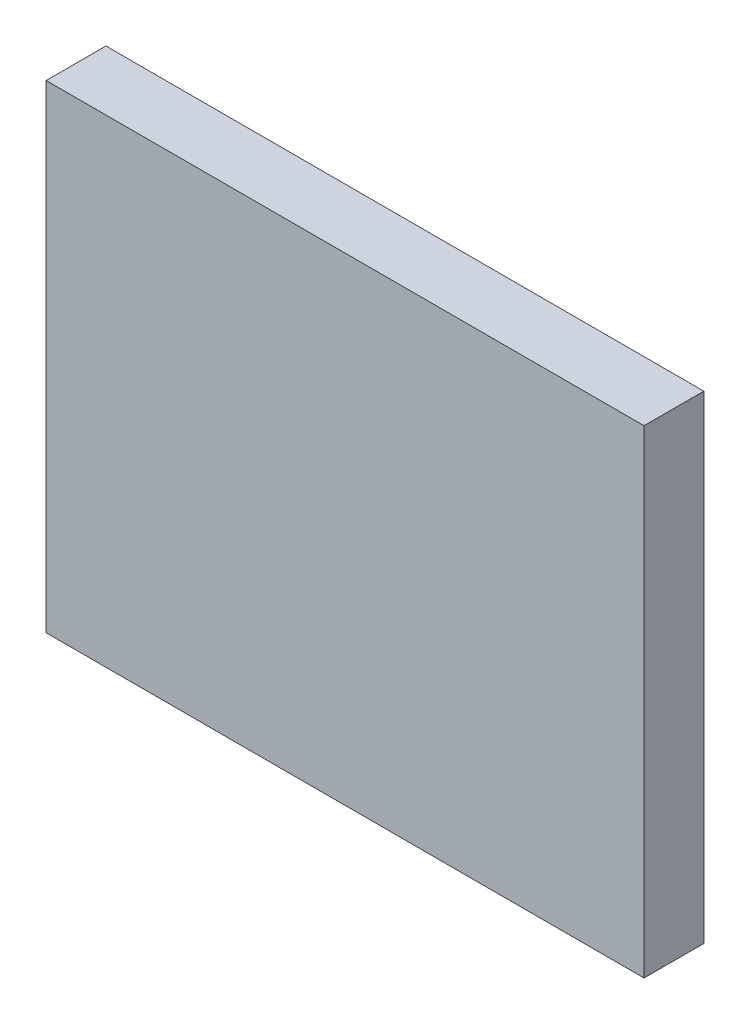
ISO-10303-21;
HEADER;
FILE_DESCRIPTION(('STEP AP214'),'2;1');
FILE_NAME('part.step','',(''),(''),'','','');
FILE_SCHEMA(('AUTOMOTIVE_DESIGN { 1 0 10303 214 1 1 1 1 }'));
ENDSEC;
DATA;
#1=APPLICATION_CONTEXT('core data for automotive mechanical design processes');
#2=APPLICATION_PROTOCOL_DEFINITION('international standard','automotive_design',2000,#1);
#3=PRODUCT_CONTEXT('',#1,'mechanical');
#4=PRODUCT('Part','Part','',(#3));
#5=PRODUCT_RELATED_PRODUCT_CATEGORY('part','',(#4));
#6=PRODUCT_DEFINITION_FORMATION('','',#4);
#7=PRODUCT_DEFINITION_CONTEXT('part definition',#1,'design');
#8=PRODUCT_DEFINITION('design','',#6,#7);
#9=PRODUCT_DEFINITION_SHAPE('','',#8);
#10=(LENGTH_UNIT() NAMED_UNIT(*) SI_UNIT(.MILLI.,.METRE.));
#11=(NAMED_UNIT(*) PLANE_ANGLE_UNIT() SI_UNIT($,.RADIAN.));
#12=(NAMED_UNIT(*) SI_UNIT($,.STERADIAN.) SOLID_ANGLE_UNIT());
#13=UNCERTAINTY_MEASURE_WITH_UNIT(LENGTH_MEASURE(1.E-05),#10,'distance_accuracy_value','');
#14=(GEOMETRIC_REPRESENTATION_CONTEXT(3) GLOBAL_UNCERTAINTY_ASSIGNED_CONTEXT((#13)) GLOBAL_UNIT_ASSIGNED_CONTEXT((#10,
#11,#12)) REPRESENTATION_CONTEXT('',''));
#15=CARTESIAN_POINT('',(0.,0.,0.));
#16=DIRECTION('',(0.,0.,1.));
#17=DIRECTION('',(1.,0.,0.));
#18=AXIS2_PLACEMENT_3D('',#15,#16,#17);
#19=CARTESIAN_POINT('',(0.,40.,5.));
#20=DIRECTION('',(1.,0.,0.));
#21=DIRECTION('',(0.,1.,0.));
#22=AXIS2_PLACEMENT_3D('',#19,#20,#21);
#23=PLANE('',#22);
#24=DIRECTION('',(0.,-1.,0.));
#25=VECTOR('',#24,1.);
#26=CARTESIAN_POINT('',(0.,40.,0.));
#27=LINE('',#26,#25);
#28=CARTESIAN_POINT('',(0.,40.,0.));
#29=VERTEX_POINT('',#28);
#30=CARTESIAN_POINT('',(0.,0.,0.));
#31=VERTEX_POINT('',#30);
#32=EDGE_CURVE('E96',#29,#31,#27,.T.);
#33=ORIENTED_EDGE('',*,*,#32,.T.);
#34=DIRECTION('',(0.,0.,-1.));
#35=VECTOR('',#34,1.);
#36=CARTESIAN_POINT('',(0.,0.,5.));
#37=LINE('',#36,#35);
#38=CARTESIAN_POINT('',(0.,0.,5.));
#39=VERTEX_POINT('',#38);
#40=EDGE_CURVE('E11',#39,#31,#37,.T.);
#41=ORIENTED_EDGE('',*,*,#40,.F.);
#42=DIRECTION('',(0.,-1.,0.));
#43=VECTOR('',#42,1.);
#44=CARTESIAN_POINT('',(0.,40.,5.));
#45=LINE('',#44,#43);
#46=CARTESIAN_POINT('',(0.,40.,5.));
#47=VERTEX_POINT('',#46);
#48=EDGE_CURVE('E84',#47,#39,#45,.T.);
#49=ORIENTED_EDGE('',*,*,#48,.F.);
#50=DIRECTION('',(0.,0.,-1.));
#51=VECTOR('',#50,1.);
#52=CARTESIAN_POINT('',(0.,40.,5.));
#53=LINE('',#52,#51);
#54=EDGE_CURVE('E92',#47,#29,#53,.T.);
#55=ORIENTED_EDGE('',*,*,#54,.T.);
#56=EDGE_LOOP('',(#33,#41,#49,#55));
#57=FACE_BOUND('',#56,.T.);
#58=ADVANCED_FACE('F33',(#57),#23,.F.);
#59=CARTESIAN_POINT('',(0.,0.,5.));
#60=DIRECTION('',(0.,1.,0.));
#61=DIRECTION('',(0.,0.,1.));
#62=AXIS2_PLACEMENT_3D('',#59,#60,#61);
#63=PLANE('',#62);
#64=DIRECTION('',(1.,0.,0.));
#65=VECTOR('',#64,1.);
#66=CARTESIAN_POINT('',(0.,0.,0.));
#67=LINE('',#66,#65);
#68=CARTESIAN_POINT('',(50.,0.,0.));
#69=VERTEX_POINT('',#68);
#70=EDGE_CURVE('E88',#31,#69,#67,.T.);
#71=ORIENTED_EDGE('',*,*,#70,.T.);
#72=DIRECTION('',(0.,0.,-1.));
#73=VECTOR('',#72,1.);
#74=CARTESIAN_POINT('',(50.,0.,5.));
#75=LINE('',#74,#73);
#76=CARTESIAN_POINT('',(50.,0.,5.));
#77=VERTEX_POINT('',#76);
#78=EDGE_CURVE('E41',#77,#69,#75,.T.);
#79=ORIENTED_EDGE('',*,*,#78,.F.);
#80=DIRECTION('',(1.,0.,0.));
#81=VECTOR('',#80,1.);
#82=CARTESIAN_POINT('',(0.,0.,5.));
#83=LINE('',#82,#81);
#84=EDGE_CURVE('E79',#39,#77,#83,.T.);
#85=ORIENTED_EDGE('',*,*,#84,.F.);
#86=ORIENTED_EDGE('',*,*,#40,.T.);
#87=EDGE_LOOP('',(#71,#79,#85,#86));
#88=FACE_BOUND('',#87,.T.);
#89=ADVANCED_FACE('F87',(#88),#63,.F.);
#90=CARTESIAN_POINT('',(50.,0.,5.));
#91=DIRECTION('',(-1.,0.,0.));
#92=DIRECTION('',(0.,0.,1.));
#93=AXIS2_PLACEMENT_3D('',#90,#91,#92);
#94=PLANE('',#93);
#95=DIRECTION('',(0.,1.,0.));
#96=VECTOR('',#95,1.);
#97=CARTESIAN_POINT('',(50.,0.,0.));
#98=LINE('',#97,#96);
#99=CARTESIAN_POINT('',(50.,40.,0.));
#100=VERTEX_POINT('',#99);
#101=EDGE_CURVE('E66',#69,#100,#98,.T.);
#102=ORIENTED_EDGE('',*,*,#101,.T.);
#103=DIRECTION('',(0.,0.,-1.));
#104=VECTOR('',#103,1.);
#105=CARTESIAN_POINT('',(50.,40.,5.));
#106=LINE('',#105,#104);
#107=CARTESIAN_POINT('',(50.,40.,5.));
#108=VERTEX_POINT('',#107);
#109=EDGE_CURVE('E89',#108,#100,#106,.T.);
#110=ORIENTED_EDGE('',*,*,#109,.F.);
#111=DIRECTION('',(0.,1.,0.));
#112=VECTOR('',#111,1.);
#113=CARTESIAN_POINT('',(50.,0.,5.));
#114=LINE('',#113,#112);
#115=EDGE_CURVE('E82',#77,#108,#114,.T.);
#116=ORIENTED_EDGE('',*,*,#115,.F.);
#117=ORIENTED_EDGE('',*,*,#78,.T.);
#118=EDGE_LOOP('',(#102,#110,#116,#117));
#119=FACE_BOUND('',#118,.T.);
#120=ADVANCED_FACE('F90',(#119),#94,.F.);
#121=CARTESIAN_POINT('',(50.,40.,5.));
#122=DIRECTION('',(0.,-1.,0.));
#123=DIRECTION('',(0.,0.,-1.));
#124=AXIS2_PLACEMENT_3D('',#121,#122,#123);
#125=PLANE('',#124);
#126=DIRECTION('',(-1.,0.,0.));
#127=VECTOR('',#126,1.);
#128=CARTESIAN_POINT('',(50.,40.,0.));
#129=LINE('',#128,#127);
#130=EDGE_CURVE('E72',#100,#29,#129,.T.);
#131=ORIENTED_EDGE('',*,*,#130,.T.);
#132=ORIENTED_EDGE('',*,*,#54,.F.);
#133=DIRECTION('',(-1.,0.,0.));
#134=VECTOR('',#133,1.);
#135=CARTESIAN_POINT('',(50.,40.,5.));
#136=LINE('',#135,#134);
#137=EDGE_CURVE('E49',#108,#47,#136,.T.);
#138=ORIENTED_EDGE('',*,*,#137,.F.);
#139=ORIENTED_EDGE('',*,*,#109,.T.);
#140=EDGE_LOOP('',(#131,#132,#138,#139));
#141=FACE_BOUND('',#140,.T.);
#142=ADVANCED_FACE('F103',(#141),#125,.F.);
#143=CARTESIAN_POINT('',(0.,0.,5.));
#144=DIRECTION('',(0.,0.,1.));
#145=DIRECTION('',(1.,0.,0.));
#146=AXIS2_PLACEMENT_3D('',#143,#144,#145);
#147=PLANE('',#146);
#148=ORIENTED_EDGE('',*,*,#48,.T.);
#149=ORIENTED_EDGE('',*,*,#84,.T.);
#150=ORIENTED_EDGE('',*,*,#115,.T.);
#151=ORIENTED_EDGE('',*,*,#137,.T.);
#152=EDGE_LOOP('',(#148,#149,#150,#151));
#153=FACE_BOUND('',#152,.T.);
#154=ADVANCED_FACE('F80',(#153),#147,.T.);
#155=CARTESIAN_POINT('',(0.,0.,0.));
#156=DIRECTION('',(0.,0.,1.));
#157=DIRECTION('',(1.,0.,0.));
#158=AXIS2_PLACEMENT_3D('',#155,#156,#157);
#159=PLANE('',#158);
#160=ORIENTED_EDGE('',*,*,#32,.F.);
#161=ORIENTED_EDGE('',*,*,#130,.F.);
#162=ORIENTED_EDGE('',*,*,#101,.F.);
#163=ORIENTED_EDGE('',*,*,#70,.F.);
#164=EDGE_LOOP('',(#160,#161,#162,#163));
#165=FACE_BOUND('',#164,.T.);
#166=ADVANCED_FACE('F106',(#165),#159,.F.);
#167=CLOSED_SHELL('',(#58,#89,#120,#142,#154,#166));
#168=MANIFOLD_SOLID_BREP('B2',#167);
#169=ADVANCED_BREP_SHAPE_REPRESENTATION('',(#18,#168),#14);
#170=SHAPE_DEFINITION_REPRESENTATION(#9,#169);
ENDSEC;
END-ISO-10303-21;
